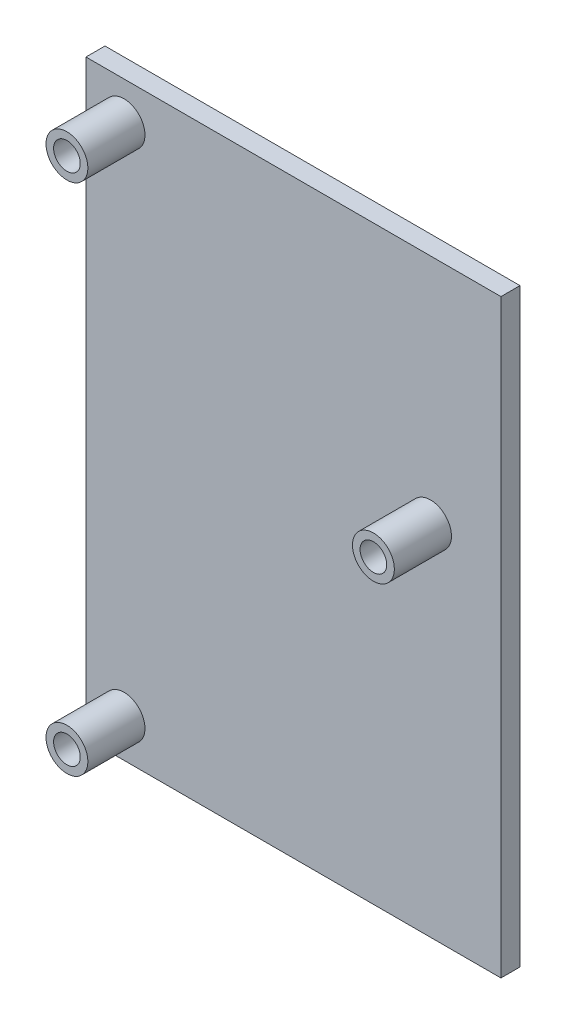
ISO-10303-21;
HEADER;
FILE_DESCRIPTION(('STEP AP214'),'2;1');
FILE_NAME('part.step','',(''),(''),'','','');
FILE_SCHEMA(('AUTOMOTIVE_DESIGN { 1 0 10303 214 1 1 1 1 }'));
ENDSEC;
DATA;
#1=APPLICATION_CONTEXT('core data for automotive mechanical design processes');
#2=APPLICATION_PROTOCOL_DEFINITION('international standard','automotive_design',2000,#1);
#3=PRODUCT_CONTEXT('',#1,'mechanical');
#4=PRODUCT('Part','Part','',(#3));
#5=PRODUCT_RELATED_PRODUCT_CATEGORY('part','',(#4));
#6=PRODUCT_DEFINITION_FORMATION('','',#4);
#7=PRODUCT_DEFINITION_CONTEXT('part definition',#1,'design');
#8=PRODUCT_DEFINITION('design','',#6,#7);
#9=PRODUCT_DEFINITION_SHAPE('','',#8);
#10=(LENGTH_UNIT() NAMED_UNIT(*) SI_UNIT(.MILLI.,.METRE.));
#11=(NAMED_UNIT(*) PLANE_ANGLE_UNIT() SI_UNIT($,.RADIAN.));
#12=(NAMED_UNIT(*) SI_UNIT($,.STERADIAN.) SOLID_ANGLE_UNIT());
#13=UNCERTAINTY_MEASURE_WITH_UNIT(LENGTH_MEASURE(1.E-05),#10,'distance_accuracy_value','');
#14=(GEOMETRIC_REPRESENTATION_CONTEXT(3) GLOBAL_UNCERTAINTY_ASSIGNED_CONTEXT((#13)) GLOBAL_UNIT_ASSIGNED_CONTEXT((#10,
#11,#12)) REPRESENTATION_CONTEXT('',''));
#15=CARTESIAN_POINT('',(0.,0.,0.));
#16=DIRECTION('',(0.,0.,1.));
#17=DIRECTION('',(1.,0.,0.));
#18=AXIS2_PLACEMENT_3D('',#15,#16,#17);
#19=CARTESIAN_POINT('',(-27.25,-38.75,-2.5));
#20=DIRECTION('',(0.,-1.,0.));
#21=DIRECTION('',(1.,0.,0.));
#22=AXIS2_PLACEMENT_3D('',#19,#20,#21);
#23=PLANE('',#22);
#24=DIRECTION('',(1.,0.,0.));
#25=VECTOR('',#24,1.);
#26=CARTESIAN_POINT('',(-27.25,-38.75,0.));
#27=LINE('',#26,#25);
#28=CARTESIAN_POINT('',(-27.25,-38.75,0.));
#29=VERTEX_POINT('',#28);
#30=CARTESIAN_POINT('',(27.25,-38.75,0.));
#31=VERTEX_POINT('',#30);
#32=EDGE_CURVE('E120',#29,#31,#27,.T.);
#33=ORIENTED_EDGE('',*,*,#32,.F.);
#34=DIRECTION('',(0.,0.,1.));
#35=VECTOR('',#34,1.);
#36=CARTESIAN_POINT('',(-27.25,-38.75,-2.5));
#37=LINE('',#36,#35);
#38=CARTESIAN_POINT('',(-27.25,-38.75,-2.5));
#39=VERTEX_POINT('',#38);
#40=EDGE_CURVE('E62',#39,#29,#37,.T.);
#41=ORIENTED_EDGE('',*,*,#40,.F.);
#42=DIRECTION('',(1.,0.,0.));
#43=VECTOR('',#42,1.);
#44=CARTESIAN_POINT('',(-27.25,-38.75,-2.5));
#45=LINE('',#44,#43);
#46=CARTESIAN_POINT('',(27.25,-38.75,-2.5));
#47=VERTEX_POINT('',#46);
#48=EDGE_CURVE('E112',#39,#47,#45,.T.);
#49=ORIENTED_EDGE('',*,*,#48,.T.);
#50=DIRECTION('',(0.,0.,1.));
#51=VECTOR('',#50,1.);
#52=CARTESIAN_POINT('',(27.25,-38.75,-2.5));
#53=LINE('',#52,#51);
#54=EDGE_CURVE('E87',#47,#31,#53,.T.);
#55=ORIENTED_EDGE('',*,*,#54,.T.);
#56=EDGE_LOOP('',(#33,#41,#49,#55));
#57=FACE_BOUND('',#56,.T.);
#58=ADVANCED_FACE('F45',(#57),#23,.T.);
#59=CARTESIAN_POINT('',(-27.25,-38.75,-2.5));
#60=DIRECTION('',(1.,0.,0.));
#61=DIRECTION('',(0.,0.,-1.));
#62=AXIS2_PLACEMENT_3D('',#59,#60,#61);
#63=PLANE('',#62);
#64=DIRECTION('',(0.,1.,0.));
#65=VECTOR('',#64,1.);
#66=CARTESIAN_POINT('',(-27.25,-38.75,0.));
#67=LINE('',#66,#65);
#68=CARTESIAN_POINT('',(-27.25,38.75,0.));
#69=VERTEX_POINT('',#68);
#70=EDGE_CURVE('E79',#29,#69,#67,.T.);
#71=ORIENTED_EDGE('',*,*,#70,.T.);
#72=DIRECTION('',(0.,0.,1.));
#73=VECTOR('',#72,1.);
#74=CARTESIAN_POINT('',(-27.25,38.75,-2.5));
#75=LINE('',#74,#73);
#76=CARTESIAN_POINT('',(-27.25,38.75,-2.5));
#77=VERTEX_POINT('',#76);
#78=EDGE_CURVE('E108',#77,#69,#75,.T.);
#79=ORIENTED_EDGE('',*,*,#78,.F.);
#80=DIRECTION('',(0.,1.,0.));
#81=VECTOR('',#80,1.);
#82=CARTESIAN_POINT('',(-27.25,-38.75,-2.5));
#83=LINE('',#82,#81);
#84=EDGE_CURVE('E97',#39,#77,#83,.T.);
#85=ORIENTED_EDGE('',*,*,#84,.F.);
#86=ORIENTED_EDGE('',*,*,#40,.T.);
#87=EDGE_LOOP('',(#71,#79,#85,#86));
#88=FACE_BOUND('',#87,.T.);
#89=ADVANCED_FACE('F174',(#88),#63,.F.);
#90=CARTESIAN_POINT('',(-27.25,38.75,-2.5));
#91=DIRECTION('',(0.,-1.,0.));
#92=DIRECTION('',(1.,0.,0.));
#93=AXIS2_PLACEMENT_3D('',#90,#91,#92);
#94=PLANE('',#93);
#95=DIRECTION('',(1.,0.,0.));
#96=VECTOR('',#95,1.);
#97=CARTESIAN_POINT('',(-27.25,38.75,0.));
#98=LINE('',#97,#96);
#99=CARTESIAN_POINT('',(27.25,38.75,0.));
#100=VERTEX_POINT('',#99);
#101=EDGE_CURVE('E105',#69,#100,#98,.T.);
#102=ORIENTED_EDGE('',*,*,#101,.T.);
#103=DIRECTION('',(0.,0.,1.));
#104=VECTOR('',#103,1.);
#105=CARTESIAN_POINT('',(27.25,38.75,-2.5));
#106=LINE('',#105,#104);
#107=CARTESIAN_POINT('',(27.25,38.75,-2.5));
#108=VERTEX_POINT('',#107);
#109=EDGE_CURVE('E102',#108,#100,#106,.T.);
#110=ORIENTED_EDGE('',*,*,#109,.F.);
#111=DIRECTION('',(1.,0.,0.));
#112=VECTOR('',#111,1.);
#113=CARTESIAN_POINT('',(-27.25,38.75,-2.5));
#114=LINE('',#113,#112);
#115=EDGE_CURVE('E92',#77,#108,#114,.T.);
#116=ORIENTED_EDGE('',*,*,#115,.F.);
#117=ORIENTED_EDGE('',*,*,#78,.T.);
#118=EDGE_LOOP('',(#102,#110,#116,#117));
#119=FACE_BOUND('',#118,.T.);
#120=ADVANCED_FACE('F103',(#119),#94,.F.);
#121=CARTESIAN_POINT('',(27.25,-38.75,-2.5));
#122=DIRECTION('',(1.,0.,0.));
#123=DIRECTION('',(0.,0.,-1.));
#124=AXIS2_PLACEMENT_3D('',#121,#122,#123);
#125=PLANE('',#124);
#126=DIRECTION('',(0.,1.,0.));
#127=VECTOR('',#126,1.);
#128=CARTESIAN_POINT('',(27.25,-38.75,0.));
#129=LINE('',#128,#127);
#130=EDGE_CURVE('E124',#31,#100,#129,.T.);
#131=ORIENTED_EDGE('',*,*,#130,.F.);
#132=ORIENTED_EDGE('',*,*,#54,.F.);
#133=DIRECTION('',(0.,1.,0.));
#134=VECTOR('',#133,1.);
#135=CARTESIAN_POINT('',(27.25,-38.75,-2.5));
#136=LINE('',#135,#134);
#137=EDGE_CURVE('E96',#47,#108,#136,.T.);
#138=ORIENTED_EDGE('',*,*,#137,.T.);
#139=ORIENTED_EDGE('',*,*,#109,.T.);
#140=EDGE_LOOP('',(#131,#132,#138,#139));
#141=FACE_BOUND('',#140,.T.);
#142=ADVANCED_FACE('F110',(#141),#125,.T.);
#143=CARTESIAN_POINT('',(0.,0.,-2.5));
#144=DIRECTION('',(0.,0.,1.));
#145=DIRECTION('',(1.,0.,0.));
#146=AXIS2_PLACEMENT_3D('',#143,#144,#145);
#147=PLANE('',#146);
#148=ORIENTED_EDGE('',*,*,#48,.F.);
#149=ORIENTED_EDGE('',*,*,#84,.T.);
#150=ORIENTED_EDGE('',*,*,#115,.T.);
#151=ORIENTED_EDGE('',*,*,#137,.F.);
#152=EDGE_LOOP('',(#148,#149,#150,#151));
#153=FACE_BOUND('',#152,.T.);
#154=ADVANCED_FACE('F95',(#153),#147,.F.);
#155=CARTESIAN_POINT('',(0.,0.,0.));
#156=DIRECTION('',(0.,0.,1.));
#157=DIRECTION('',(1.,0.,0.));
#158=AXIS2_PLACEMENT_3D('',#155,#156,#157);
#159=PLANE('',#158);
#160=CARTESIAN_POINT('',(-22.25,-33.75,0.));
#161=DIRECTION('',(0.,0.,1.));
#162=DIRECTION('',(1.,0.,0.));
#163=AXIS2_PLACEMENT_3D('',#160,#161,#162);
#164=CIRCLE('',#163,2.75);
#165=CARTESIAN_POINT('',(-19.5,-33.75,0.));
#166=VERTEX_POINT('',#165);
#167=EDGE_CURVE('E192',#166,#166,#164,.T.);
#168=ORIENTED_EDGE('',*,*,#167,.F.);
#169=EDGE_LOOP('',(#168));
#170=FACE_BOUND('',#169,.T.);
#171=CARTESIAN_POINT('',(18.,8.25,0.));
#172=DIRECTION('',(0.,0.,1.));
#173=DIRECTION('',(1.,0.,0.));
#174=AXIS2_PLACEMENT_3D('',#171,#172,#173);
#175=CIRCLE('',#174,2.75);
#176=CARTESIAN_POINT('',(20.75,8.25,0.));
#177=VERTEX_POINT('',#176);
#178=EDGE_CURVE('E196',#177,#177,#175,.T.);
#179=ORIENTED_EDGE('',*,*,#178,.F.);
#180=EDGE_LOOP('',(#179));
#181=FACE_BOUND('',#180,.T.);
#182=CARTESIAN_POINT('',(-22.25,33.75,0.));
#183=DIRECTION('',(0.,0.,1.));
#184=DIRECTION('',(1.,0.,0.));
#185=AXIS2_PLACEMENT_3D('',#182,#183,#184);
#186=CIRCLE('',#185,2.75);
#187=CARTESIAN_POINT('',(-19.5,33.75,0.));
#188=VERTEX_POINT('',#187);
#189=EDGE_CURVE('E199',#188,#188,#186,.T.);
#190=ORIENTED_EDGE('',*,*,#189,.F.);
#191=EDGE_LOOP('',(#190));
#192=FACE_BOUND('',#191,.T.);
#193=ORIENTED_EDGE('',*,*,#32,.T.);
#194=ORIENTED_EDGE('',*,*,#130,.T.);
#195=ORIENTED_EDGE('',*,*,#101,.F.);
#196=ORIENTED_EDGE('',*,*,#70,.F.);
#197=EDGE_LOOP('',(#193,#194,#195,#196));
#198=FACE_BOUND('',#197,.T.);
#199=ADVANCED_FACE('F164',(#170,#181,#192,#198),#159,.T.);
#200=CARTESIAN_POINT('',(-22.25,33.75,7.5));
#201=DIRECTION('',(0.,0.,-1.));
#202=DIRECTION('',(-1.,0.,0.));
#203=AXIS2_PLACEMENT_3D('',#200,#201,#202);
#204=CYLINDRICAL_SURFACE('',#203,1.75);
#205=CARTESIAN_POINT('',(-22.25,33.75,7.5));
#206=DIRECTION('',(0.,0.,1.));
#207=DIRECTION('',(1.,0.,0.));
#208=AXIS2_PLACEMENT_3D('',#205,#206,#207);
#209=CIRCLE('',#208,1.75);
#210=CARTESIAN_POINT('',(-20.5,33.75,7.5));
#211=VERTEX_POINT('',#210);
#212=EDGE_CURVE('E202',#211,#211,#209,.T.);
#213=ORIENTED_EDGE('',*,*,#212,.T.);
#214=EDGE_LOOP('',(#213));
#215=FACE_BOUND('',#214,.T.);
#216=CARTESIAN_POINT('',(-22.25,33.75,0.));
#217=DIRECTION('',(0.,0.,1.));
#218=DIRECTION('',(1.,0.,0.));
#219=AXIS2_PLACEMENT_3D('',#216,#217,#218);
#220=CIRCLE('',#219,1.75);
#221=CARTESIAN_POINT('',(-20.5,33.75,0.));
#222=VERTEX_POINT('',#221);
#223=EDGE_CURVE('E134',#222,#222,#220,.F.);
#224=ORIENTED_EDGE('',*,*,#223,.T.);
#225=EDGE_LOOP('',(#224));
#226=FACE_BOUND('',#225,.T.);
#227=ADVANCED_FACE('F180',(#215,#226),#204,.F.);
#228=CARTESIAN_POINT('',(-22.25,33.75,7.5));
#229=DIRECTION('',(0.,0.,-1.));
#230=DIRECTION('',(-1.,0.,0.));
#231=AXIS2_PLACEMENT_3D('',#228,#229,#230);
#232=CYLINDRICAL_SURFACE('',#231,2.75);
#233=CARTESIAN_POINT('',(-22.25,33.75,7.5));
#234=DIRECTION('',(0.,0.,1.));
#235=DIRECTION('',(1.,0.,0.));
#236=AXIS2_PLACEMENT_3D('',#233,#234,#235);
#237=CIRCLE('',#236,2.75);
#238=CARTESIAN_POINT('',(-19.5,33.75,7.5));
#239=VERTEX_POINT('',#238);
#240=EDGE_CURVE('E205',#239,#239,#237,.T.);
#241=ORIENTED_EDGE('',*,*,#240,.F.);
#242=EDGE_LOOP('',(#241));
#243=FACE_BOUND('',#242,.T.);
#244=ORIENTED_EDGE('',*,*,#189,.T.);
#245=EDGE_LOOP('',(#244));
#246=FACE_BOUND('',#245,.T.);
#247=ADVANCED_FACE('F186',(#243,#246),#232,.T.);
#248=CARTESIAN_POINT('',(0.,0.,7.5));
#249=DIRECTION('',(0.,0.,1.));
#250=DIRECTION('',(1.,0.,0.));
#251=AXIS2_PLACEMENT_3D('',#248,#249,#250);
#252=PLANE('',#251);
#253=ORIENTED_EDGE('',*,*,#212,.F.);
#254=EDGE_LOOP('',(#253));
#255=FACE_BOUND('',#254,.T.);
#256=ORIENTED_EDGE('',*,*,#240,.T.);
#257=EDGE_LOOP('',(#256));
#258=FACE_BOUND('',#257,.T.);
#259=ADVANCED_FACE('F168',(#255,#258),#252,.T.);
#260=ORIENTED_EDGE('',*,*,#223,.F.);
#261=EDGE_LOOP('',(#260));
#262=FACE_BOUND('',#261,.T.);
#263=ADVANCED_FACE('F152',(#262),#159,.T.);
#264=CARTESIAN_POINT('',(18.,8.25,7.5));
#265=DIRECTION('',(0.,0.,-1.));
#266=DIRECTION('',(-1.,0.,0.));
#267=AXIS2_PLACEMENT_3D('',#264,#265,#266);
#268=CYLINDRICAL_SURFACE('',#267,1.75);
#269=CARTESIAN_POINT('',(18.,8.25,7.5));
#270=DIRECTION('',(0.,0.,1.));
#271=DIRECTION('',(1.,0.,0.));
#272=AXIS2_PLACEMENT_3D('',#269,#270,#271);
#273=CIRCLE('',#272,1.75);
#274=CARTESIAN_POINT('',(19.75,8.25,7.5));
#275=VERTEX_POINT('',#274);
#276=EDGE_CURVE('E213',#275,#275,#273,.T.);
#277=ORIENTED_EDGE('',*,*,#276,.T.);
#278=EDGE_LOOP('',(#277));
#279=FACE_BOUND('',#278,.T.);
#280=CARTESIAN_POINT('',(18.,8.25,0.));
#281=DIRECTION('',(0.,0.,1.));
#282=DIRECTION('',(1.,0.,0.));
#283=AXIS2_PLACEMENT_3D('',#280,#281,#282);
#284=CIRCLE('',#283,1.75);
#285=CARTESIAN_POINT('',(19.75,8.25,0.));
#286=VERTEX_POINT('',#285);
#287=EDGE_CURVE('E54',#286,#286,#284,.F.);
#288=ORIENTED_EDGE('',*,*,#287,.T.);
#289=EDGE_LOOP('',(#288));
#290=FACE_BOUND('',#289,.T.);
#291=ADVANCED_FACE('F145',(#279,#290),#268,.F.);
#292=CARTESIAN_POINT('',(18.,8.25,7.5));
#293=DIRECTION('',(0.,0.,-1.));
#294=DIRECTION('',(-1.,0.,0.));
#295=AXIS2_PLACEMENT_3D('',#292,#293,#294);
#296=CYLINDRICAL_SURFACE('',#295,2.75);
#297=CARTESIAN_POINT('',(18.,8.25,7.5));
#298=DIRECTION('',(0.,0.,1.));
#299=DIRECTION('',(1.,0.,0.));
#300=AXIS2_PLACEMENT_3D('',#297,#298,#299);
#301=CIRCLE('',#300,2.75);
#302=CARTESIAN_POINT('',(20.75,8.25,7.5));
#303=VERTEX_POINT('',#302);
#304=EDGE_CURVE('E214',#303,#303,#301,.T.);
#305=ORIENTED_EDGE('',*,*,#304,.F.);
#306=EDGE_LOOP('',(#305));
#307=FACE_BOUND('',#306,.T.);
#308=ORIENTED_EDGE('',*,*,#178,.T.);
#309=EDGE_LOOP('',(#308));
#310=FACE_BOUND('',#309,.T.);
#311=ADVANCED_FACE('F161',(#307,#310),#296,.T.);
#312=CARTESIAN_POINT('',(0.,0.,7.5));
#313=DIRECTION('',(0.,0.,1.));
#314=DIRECTION('',(1.,0.,0.));
#315=AXIS2_PLACEMENT_3D('',#312,#313,#314);
#316=PLANE('',#315);
#317=ORIENTED_EDGE('',*,*,#276,.F.);
#318=EDGE_LOOP('',(#317));
#319=FACE_BOUND('',#318,.T.);
#320=ORIENTED_EDGE('',*,*,#304,.T.);
#321=EDGE_LOOP('',(#320));
#322=FACE_BOUND('',#321,.T.);
#323=ADVANCED_FACE('F150',(#319,#322),#316,.T.);
#324=ORIENTED_EDGE('',*,*,#287,.F.);
#325=EDGE_LOOP('',(#324));
#326=FACE_BOUND('',#325,.T.);
#327=ADVANCED_FACE('F147',(#326),#159,.T.);
#328=CARTESIAN_POINT('',(-22.25,-33.75,7.5));
#329=DIRECTION('',(0.,0.,-1.));
#330=DIRECTION('',(-1.,0.,0.));
#331=AXIS2_PLACEMENT_3D('',#328,#329,#330);
#332=CYLINDRICAL_SURFACE('',#331,1.75);
#333=CARTESIAN_POINT('',(-22.25,-33.75,7.5));
#334=DIRECTION('',(0.,0.,1.));
#335=DIRECTION('',(1.,0.,0.));
#336=AXIS2_PLACEMENT_3D('',#333,#334,#335);
#337=CIRCLE('',#336,1.75);
#338=CARTESIAN_POINT('',(-20.5,-33.75,7.5));
#339=VERTEX_POINT('',#338);
#340=EDGE_CURVE('E223',#339,#339,#337,.T.);
#341=ORIENTED_EDGE('',*,*,#340,.T.);
#342=EDGE_LOOP('',(#341));
#343=FACE_BOUND('',#342,.T.);
#344=CARTESIAN_POINT('',(-22.25,-33.75,0.));
#345=DIRECTION('',(0.,0.,1.));
#346=DIRECTION('',(1.,0.,0.));
#347=AXIS2_PLACEMENT_3D('',#344,#345,#346);
#348=CIRCLE('',#347,1.75);
#349=CARTESIAN_POINT('',(-20.5,-33.75,0.));
#350=VERTEX_POINT('',#349);
#351=EDGE_CURVE('E11',#350,#350,#348,.F.);
#352=ORIENTED_EDGE('',*,*,#351,.T.);
#353=EDGE_LOOP('',(#352));
#354=FACE_BOUND('',#353,.T.);
#355=ADVANCED_FACE('F149',(#343,#354),#332,.F.);
#356=CARTESIAN_POINT('',(-22.25,-33.75,7.5));
#357=DIRECTION('',(0.,0.,-1.));
#358=DIRECTION('',(-1.,0.,0.));
#359=AXIS2_PLACEMENT_3D('',#356,#357,#358);
#360=CYLINDRICAL_SURFACE('',#359,2.75);
#361=CARTESIAN_POINT('',(-22.25,-33.75,7.5));
#362=DIRECTION('',(0.,0.,1.));
#363=DIRECTION('',(1.,0.,0.));
#364=AXIS2_PLACEMENT_3D('',#361,#362,#363);
#365=CIRCLE('',#364,2.75);
#366=CARTESIAN_POINT('',(-19.5,-33.75,7.5));
#367=VERTEX_POINT('',#366);
#368=EDGE_CURVE('E125',#367,#367,#365,.T.);
#369=ORIENTED_EDGE('',*,*,#368,.F.);
#370=EDGE_LOOP('',(#369));
#371=FACE_BOUND('',#370,.T.);
#372=ORIENTED_EDGE('',*,*,#167,.T.);
#373=EDGE_LOOP('',(#372));
#374=FACE_BOUND('',#373,.T.);
#375=ADVANCED_FACE('F158',(#371,#374),#360,.T.);
#376=CARTESIAN_POINT('',(0.,0.,7.5));
#377=DIRECTION('',(0.,0.,1.));
#378=DIRECTION('',(1.,0.,0.));
#379=AXIS2_PLACEMENT_3D('',#376,#377,#378);
#380=PLANE('',#379);
#381=ORIENTED_EDGE('',*,*,#340,.F.);
#382=EDGE_LOOP('',(#381));
#383=FACE_BOUND('',#382,.T.);
#384=ORIENTED_EDGE('',*,*,#368,.T.);
#385=EDGE_LOOP('',(#384));
#386=FACE_BOUND('',#385,.T.);
#387=ADVANCED_FACE('F171',(#383,#386),#380,.T.);
#388=ORIENTED_EDGE('',*,*,#351,.F.);
#389=EDGE_LOOP('',(#388));
#390=FACE_BOUND('',#389,.T.);
#391=ADVANCED_FACE('F153',(#390),#159,.T.);
#392=CLOSED_SHELL('',(#58,#89,#120,#142,#154,#199,#227,#247,#259,#263,#291,#311,#323,#327,#355,
#375,#387,#391));
#393=MANIFOLD_SOLID_BREP('B2',#392);
#394=ADVANCED_BREP_SHAPE_REPRESENTATION('',(#18,#393),#14);
#395=SHAPE_DEFINITION_REPRESENTATION(#9,#394);
ENDSEC;
END-ISO-10303-21;
